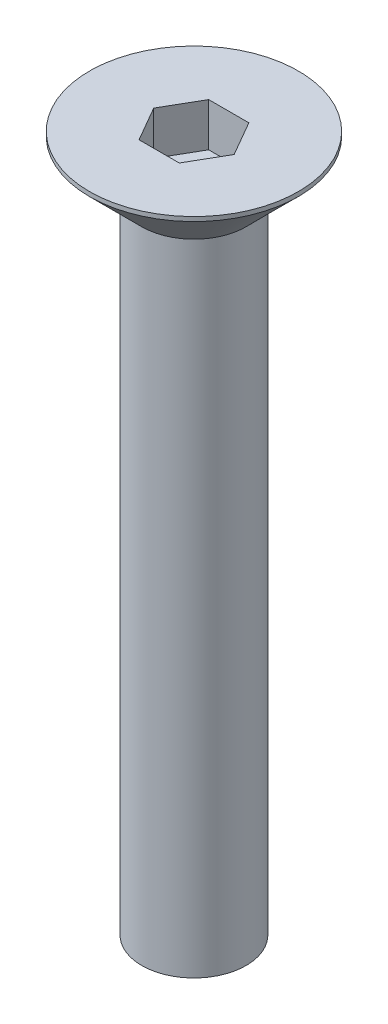
ISO-10303-21;
HEADER;
FILE_DESCRIPTION(('STEP AP214'),'2;1');
FILE_NAME('part.step','',(''),(''),'','','');
FILE_SCHEMA(('AUTOMOTIVE_DESIGN { 1 0 10303 214 1 1 1 1 }'));
ENDSEC;
DATA;
#1=APPLICATION_CONTEXT('core data for automotive mechanical design processes');
#2=APPLICATION_PROTOCOL_DEFINITION('international standard','automotive_design',2000,#1);
#3=PRODUCT_CONTEXT('',#1,'mechanical');
#4=PRODUCT('Part','Part','',(#3));
#5=PRODUCT_RELATED_PRODUCT_CATEGORY('part','',(#4));
#6=PRODUCT_DEFINITION_FORMATION('','',#4);
#7=PRODUCT_DEFINITION_CONTEXT('part definition',#1,'design');
#8=PRODUCT_DEFINITION('design','',#6,#7);
#9=PRODUCT_DEFINITION_SHAPE('','',#8);
#10=(LENGTH_UNIT() NAMED_UNIT(*) SI_UNIT(.MILLI.,.METRE.));
#11=(NAMED_UNIT(*) PLANE_ANGLE_UNIT() SI_UNIT($,.RADIAN.));
#12=(NAMED_UNIT(*) SI_UNIT($,.STERADIAN.) SOLID_ANGLE_UNIT());
#13=UNCERTAINTY_MEASURE_WITH_UNIT(LENGTH_MEASURE(1.E-05),#10,'distance_accuracy_value','');
#14=(GEOMETRIC_REPRESENTATION_CONTEXT(3) GLOBAL_UNCERTAINTY_ASSIGNED_CONTEXT((#13)) GLOBAL_UNIT_ASSIGNED_CONTEXT((#10,
#11,#12)) REPRESENTATION_CONTEXT('',''));
#15=CARTESIAN_POINT('',(0.,0.,0.));
#16=DIRECTION('',(0.,0.,1.));
#17=DIRECTION('',(1.,0.,0.));
#18=AXIS2_PLACEMENT_3D('',#15,#16,#17);
#19=CARTESIAN_POINT('',(0.,-80.,0.));
#20=DIRECTION('',(0.,1.,0.));
#21=DIRECTION('',(0.,0.,1.));
#22=AXIS2_PLACEMENT_3D('',#19,#20,#21);
#23=PLANE('',#22);
#24=CARTESIAN_POINT('',(0.,-80.,0.));
#25=DIRECTION('',(0.,1.,0.));
#26=DIRECTION('',(0.,0.,1.));
#27=AXIS2_PLACEMENT_3D('',#24,#25,#26);
#28=CIRCLE('',#27,6.00000000000002);
#29=CARTESIAN_POINT('',(0.,-80.,6.00000000000002));
#30=VERTEX_POINT('',#29);
#31=EDGE_CURVE('E11',#30,#30,#28,.T.);
#32=ORIENTED_EDGE('',*,*,#31,.F.);
#33=EDGE_LOOP('',(#32));
#34=FACE_BOUND('',#33,.T.);
#35=ADVANCED_FACE('F36',(#34),#23,.F.);
#36=CARTESIAN_POINT('',(0.,61.6916426261037,0.));
#37=DIRECTION('',(0.,1.,0.));
#38=DIRECTION('',(0.,0.,1.));
#39=AXIS2_PLACEMENT_3D('',#36,#37,#38);
#40=CYLINDRICAL_SURFACE('',#39,6.00000000000001);
#41=CARTESIAN_POINT('',(0.,-6.50000000000001,0.));
#42=DIRECTION('',(0.,1.,0.));
#43=DIRECTION('',(0.,0.,1.));
#44=AXIS2_PLACEMENT_3D('',#41,#42,#43);
#45=CIRCLE('',#44,6.00000000000001);
#46=CARTESIAN_POINT('',(0.,-6.50000000000001,6.00000000000001));
#47=VERTEX_POINT('',#46);
#48=EDGE_CURVE('E43',#47,#47,#45,.T.);
#49=ORIENTED_EDGE('',*,*,#48,.F.);
#50=EDGE_LOOP('',(#49));
#51=FACE_BOUND('',#50,.T.);
#52=ORIENTED_EDGE('',*,*,#31,.T.);
#53=EDGE_LOOP('',(#52));
#54=FACE_BOUND('',#53,.T.);
#55=ADVANCED_FACE('F152',(#51,#54),#40,.T.);
#56=CARTESIAN_POINT('',(0.,-6.50000000000001,0.));
#57=DIRECTION('',(0.,1.,0.));
#58=DIRECTION('',(0.,0.,1.));
#59=AXIS2_PLACEMENT_3D('',#56,#57,#58);
#60=CONICAL_SURFACE('',#59,6.00000000000001,0.785398163397447);
#61=CARTESIAN_POINT('',(0.,-0.5,0.));
#62=DIRECTION('',(0.,1.,0.));
#63=DIRECTION('',(0.,0.,1.));
#64=AXIS2_PLACEMENT_3D('',#61,#62,#63);
#65=CIRCLE('',#64,12.);
#66=CARTESIAN_POINT('',(0.,-0.5,12.));
#67=VERTEX_POINT('',#66);
#68=EDGE_CURVE('E145',#67,#67,#65,.T.);
#69=ORIENTED_EDGE('',*,*,#68,.F.);
#70=EDGE_LOOP('',(#69));
#71=FACE_BOUND('',#70,.T.);
#72=ORIENTED_EDGE('',*,*,#48,.T.);
#73=EDGE_LOOP('',(#72));
#74=FACE_BOUND('',#73,.T.);
#75=ADVANCED_FACE('F150',(#71,#74),#60,.T.);
#76=CARTESIAN_POINT('',(0.,61.6916426261037,0.));
#77=DIRECTION('',(0.,1.,0.));
#78=DIRECTION('',(0.,0.,1.));
#79=AXIS2_PLACEMENT_3D('',#76,#77,#78);
#80=CYLINDRICAL_SURFACE('',#79,12.);
#81=CARTESIAN_POINT('',(0.,0.,0.));
#82=DIRECTION('',(0.,1.,0.));
#83=DIRECTION('',(0.,0.,1.));
#84=AXIS2_PLACEMENT_3D('',#81,#82,#83);
#85=CIRCLE('',#84,12.);
#86=CARTESIAN_POINT('',(0.,0.,12.));
#87=VERTEX_POINT('',#86);
#88=EDGE_CURVE('E137',#87,#87,#85,.T.);
#89=ORIENTED_EDGE('',*,*,#88,.F.);
#90=EDGE_LOOP('',(#89));
#91=FACE_BOUND('',#90,.T.);
#92=ORIENTED_EDGE('',*,*,#68,.T.);
#93=EDGE_LOOP('',(#92));
#94=FACE_BOUND('',#93,.T.);
#95=ADVANCED_FACE('F170',(#91,#94),#80,.T.);
#96=CARTESIAN_POINT('',(12.,0.,0.));
#97=DIRECTION('',(0.,-1.,0.));
#98=DIRECTION('',(0.,0.,-1.));
#99=AXIS2_PLACEMENT_3D('',#96,#97,#98);
#100=PLANE('',#99);
#101=DIRECTION('',(-1.,0.,0.));
#102=VECTOR('',#101,1.);
#103=CARTESIAN_POINT('',(2.3094010767585,0.,-4.));
#104=LINE('',#103,#102);
#105=CARTESIAN_POINT('',(2.3094010767585,0.,-4.));
#106=VERTEX_POINT('',#105);
#107=CARTESIAN_POINT('',(-2.3094010767585,0.,-4.));
#108=VERTEX_POINT('',#107);
#109=EDGE_CURVE('E124',#106,#108,#104,.T.);
#110=ORIENTED_EDGE('',*,*,#109,.F.);
#111=DIRECTION('',(-0.5,0.,-0.866025403784439));
#112=VECTOR('',#111,1.);
#113=CARTESIAN_POINT('',(4.61880215351701,0.,0.));
#114=LINE('',#113,#112);
#115=CARTESIAN_POINT('',(4.61880215351701,0.,0.));
#116=VERTEX_POINT('',#115);
#117=EDGE_CURVE('E50',#116,#106,#114,.T.);
#118=ORIENTED_EDGE('',*,*,#117,.F.);
#119=DIRECTION('',(0.5,0.,-0.866025403784439));
#120=VECTOR('',#119,1.);
#121=CARTESIAN_POINT('',(2.3094010767585,0.,4.));
#122=LINE('',#121,#120);
#123=CARTESIAN_POINT('',(2.3094010767585,0.,4.));
#124=VERTEX_POINT('',#123);
#125=EDGE_CURVE('E133',#124,#116,#122,.T.);
#126=ORIENTED_EDGE('',*,*,#125,.F.);
#127=DIRECTION('',(1.,0.,0.));
#128=VECTOR('',#127,1.);
#129=CARTESIAN_POINT('',(-2.3094010767585,0.,4.));
#130=LINE('',#129,#128);
#131=CARTESIAN_POINT('',(-2.3094010767585,0.,4.));
#132=VERTEX_POINT('',#131);
#133=EDGE_CURVE('E131',#132,#124,#130,.T.);
#134=ORIENTED_EDGE('',*,*,#133,.F.);
#135=DIRECTION('',(0.5,0.,0.866025403784438));
#136=VECTOR('',#135,1.);
#137=CARTESIAN_POINT('',(-4.61880215351701,0.,0.));
#138=LINE('',#137,#136);
#139=CARTESIAN_POINT('',(-4.61880215351701,0.,0.));
#140=VERTEX_POINT('',#139);
#141=EDGE_CURVE('E98',#140,#132,#138,.T.);
#142=ORIENTED_EDGE('',*,*,#141,.F.);
#143=DIRECTION('',(-0.5,0.,0.866025403784439));
#144=VECTOR('',#143,1.);
#145=CARTESIAN_POINT('',(-2.3094010767585,0.,-4.));
#146=LINE('',#145,#144);
#147=EDGE_CURVE('E127',#108,#140,#146,.T.);
#148=ORIENTED_EDGE('',*,*,#147,.F.);
#149=EDGE_LOOP('',(#110,#118,#126,#134,#142,#148));
#150=FACE_BOUND('',#149,.T.);
#151=ORIENTED_EDGE('',*,*,#88,.T.);
#152=EDGE_LOOP('',(#151));
#153=FACE_BOUND('',#152,.T.);
#154=ADVANCED_FACE('F178',(#150,#153),#100,.F.);
#155=CARTESIAN_POINT('',(4.61880215351701,-5.,0.));
#156=DIRECTION('',(0.866025403784439,0.,-0.5));
#157=DIRECTION('',(-0.5,0.,-0.866025403784439));
#158=AXIS2_PLACEMENT_3D('',#155,#156,#157);
#159=PLANE('',#158);
#160=ORIENTED_EDGE('',*,*,#117,.T.);
#161=DIRECTION('',(0.,1.,0.));
#162=VECTOR('',#161,1.);
#163=CARTESIAN_POINT('',(2.3094010767585,-5.,-4.));
#164=LINE('',#163,#162);
#165=CARTESIAN_POINT('',(2.3094010767585,-5.,-4.));
#166=VERTEX_POINT('',#165);
#167=EDGE_CURVE('E80',#166,#106,#164,.T.);
#168=ORIENTED_EDGE('',*,*,#167,.F.);
#169=DIRECTION('',(-0.5,0.,-0.866025403784439));
#170=VECTOR('',#169,1.);
#171=CARTESIAN_POINT('',(4.61880215351701,-5.,0.));
#172=LINE('',#171,#170);
#173=CARTESIAN_POINT('',(4.61880215351701,-5.,0.));
#174=VERTEX_POINT('',#173);
#175=EDGE_CURVE('E135',#174,#166,#172,.T.);
#176=ORIENTED_EDGE('',*,*,#175,.F.);
#177=DIRECTION('',(0.,1.,0.));
#178=VECTOR('',#177,1.);
#179=CARTESIAN_POINT('',(4.61880215351701,-5.,0.));
#180=LINE('',#179,#178);
#181=EDGE_CURVE('E58',#174,#116,#180,.T.);
#182=ORIENTED_EDGE('',*,*,#181,.T.);
#183=EDGE_LOOP('',(#160,#168,#176,#182));
#184=FACE_BOUND('',#183,.T.);
#185=ADVANCED_FACE('F186',(#184),#159,.F.);
#186=CARTESIAN_POINT('',(2.3094010767585,-5.,4.));
#187=DIRECTION('',(0.866025403784439,0.,0.5));
#188=DIRECTION('',(0.5,0.,-0.866025403784439));
#189=AXIS2_PLACEMENT_3D('',#186,#187,#188);
#190=PLANE('',#189);
#191=ORIENTED_EDGE('',*,*,#125,.T.);
#192=ORIENTED_EDGE('',*,*,#181,.F.);
#193=DIRECTION('',(0.5,0.,-0.866025403784439));
#194=VECTOR('',#193,1.);
#195=CARTESIAN_POINT('',(2.3094010767585,-5.,4.));
#196=LINE('',#195,#194);
#197=CARTESIAN_POINT('',(2.3094010767585,-5.,4.));
#198=VERTEX_POINT('',#197);
#199=EDGE_CURVE('E110',#198,#174,#196,.T.);
#200=ORIENTED_EDGE('',*,*,#199,.F.);
#201=DIRECTION('',(0.,1.,0.));
#202=VECTOR('',#201,1.);
#203=CARTESIAN_POINT('',(2.3094010767585,-5.,4.));
#204=LINE('',#203,#202);
#205=EDGE_CURVE('E102',#198,#124,#204,.T.);
#206=ORIENTED_EDGE('',*,*,#205,.T.);
#207=EDGE_LOOP('',(#191,#192,#200,#206));
#208=FACE_BOUND('',#207,.T.);
#209=ADVANCED_FACE('F194',(#208),#190,.F.);
#210=CARTESIAN_POINT('',(-2.3094010767585,-5.,4.));
#211=DIRECTION('',(0.,0.,1.));
#212=DIRECTION('',(1.,0.,0.));
#213=AXIS2_PLACEMENT_3D('',#210,#211,#212);
#214=PLANE('',#213);
#215=ORIENTED_EDGE('',*,*,#133,.T.);
#216=ORIENTED_EDGE('',*,*,#205,.F.);
#217=DIRECTION('',(1.,0.,0.));
#218=VECTOR('',#217,1.);
#219=CARTESIAN_POINT('',(-2.3094010767585,-5.,4.));
#220=LINE('',#219,#218);
#221=CARTESIAN_POINT('',(-2.3094010767585,-5.,4.));
#222=VERTEX_POINT('',#221);
#223=EDGE_CURVE('E106',#222,#198,#220,.T.);
#224=ORIENTED_EDGE('',*,*,#223,.F.);
#225=DIRECTION('',(0.,1.,0.));
#226=VECTOR('',#225,1.);
#227=CARTESIAN_POINT('',(-2.3094010767585,-5.,4.));
#228=LINE('',#227,#226);
#229=EDGE_CURVE('E91',#222,#132,#228,.T.);
#230=ORIENTED_EDGE('',*,*,#229,.T.);
#231=EDGE_LOOP('',(#215,#216,#224,#230));
#232=FACE_BOUND('',#231,.T.);
#233=ADVANCED_FACE('F107',(#232),#214,.F.);
#234=CARTESIAN_POINT('',(-4.61880215351701,-5.,0.));
#235=DIRECTION('',(-0.866025403784438,0.,0.5));
#236=DIRECTION('',(0.5,0.,0.866025403784439));
#237=AXIS2_PLACEMENT_3D('',#234,#235,#236);
#238=PLANE('',#237);
#239=ORIENTED_EDGE('',*,*,#141,.T.);
#240=ORIENTED_EDGE('',*,*,#229,.F.);
#241=DIRECTION('',(0.5,0.,0.866025403784438));
#242=VECTOR('',#241,1.);
#243=CARTESIAN_POINT('',(-4.61880215351701,-5.,0.));
#244=LINE('',#243,#242);
#245=CARTESIAN_POINT('',(-4.61880215351701,-5.,0.));
#246=VERTEX_POINT('',#245);
#247=EDGE_CURVE('E95',#246,#222,#244,.T.);
#248=ORIENTED_EDGE('',*,*,#247,.F.);
#249=DIRECTION('',(0.,1.,0.));
#250=VECTOR('',#249,1.);
#251=CARTESIAN_POINT('',(-4.61880215351701,-5.,0.));
#252=LINE('',#251,#250);
#253=EDGE_CURVE('E103',#246,#140,#252,.T.);
#254=ORIENTED_EDGE('',*,*,#253,.T.);
#255=EDGE_LOOP('',(#239,#240,#248,#254));
#256=FACE_BOUND('',#255,.T.);
#257=ADVANCED_FACE('F93',(#256),#238,.F.);
#258=CARTESIAN_POINT('',(-2.3094010767585,-5.,-4.));
#259=DIRECTION('',(-0.866025403784439,0.,-0.5));
#260=DIRECTION('',(-0.5,0.,0.866025403784439));
#261=AXIS2_PLACEMENT_3D('',#258,#259,#260);
#262=PLANE('',#261);
#263=ORIENTED_EDGE('',*,*,#147,.T.);
#264=ORIENTED_EDGE('',*,*,#253,.F.);
#265=DIRECTION('',(-0.5,0.,0.866025403784439));
#266=VECTOR('',#265,1.);
#267=CARTESIAN_POINT('',(-2.3094010767585,-5.,-4.));
#268=LINE('',#267,#266);
#269=CARTESIAN_POINT('',(-2.3094010767585,-5.,-4.));
#270=VERTEX_POINT('',#269);
#271=EDGE_CURVE('E116',#270,#246,#268,.T.);
#272=ORIENTED_EDGE('',*,*,#271,.F.);
#273=DIRECTION('',(0.,1.,0.));
#274=VECTOR('',#273,1.);
#275=CARTESIAN_POINT('',(-2.3094010767585,-5.,-4.));
#276=LINE('',#275,#274);
#277=EDGE_CURVE('E140',#270,#108,#276,.T.);
#278=ORIENTED_EDGE('',*,*,#277,.T.);
#279=EDGE_LOOP('',(#263,#264,#272,#278));
#280=FACE_BOUND('',#279,.T.);
#281=ADVANCED_FACE('F213',(#280),#262,.F.);
#282=CARTESIAN_POINT('',(2.3094010767585,-5.,-4.));
#283=DIRECTION('',(0.,0.,-1.));
#284=DIRECTION('',(-1.,0.,0.));
#285=AXIS2_PLACEMENT_3D('',#282,#283,#284);
#286=PLANE('',#285);
#287=ORIENTED_EDGE('',*,*,#109,.T.);
#288=ORIENTED_EDGE('',*,*,#277,.F.);
#289=DIRECTION('',(-1.,0.,0.));
#290=VECTOR('',#289,1.);
#291=CARTESIAN_POINT('',(2.3094010767585,-5.,-4.));
#292=LINE('',#291,#290);
#293=EDGE_CURVE('E118',#166,#270,#292,.T.);
#294=ORIENTED_EDGE('',*,*,#293,.F.);
#295=ORIENTED_EDGE('',*,*,#167,.T.);
#296=EDGE_LOOP('',(#287,#288,#294,#295));
#297=FACE_BOUND('',#296,.T.);
#298=ADVANCED_FACE('F220',(#297),#286,.F.);
#299=CARTESIAN_POINT('',(6.92820323027551,-5.,4.));
#300=DIRECTION('',(0.,-1.,0.));
#301=DIRECTION('',(0.,0.,-1.));
#302=AXIS2_PLACEMENT_3D('',#299,#300,#301);
#303=PLANE('',#302);
#304=ORIENTED_EDGE('',*,*,#175,.T.);
#305=ORIENTED_EDGE('',*,*,#293,.T.);
#306=ORIENTED_EDGE('',*,*,#271,.T.);
#307=ORIENTED_EDGE('',*,*,#247,.T.);
#308=ORIENTED_EDGE('',*,*,#223,.T.);
#309=ORIENTED_EDGE('',*,*,#199,.T.);
#310=EDGE_LOOP('',(#304,#305,#306,#307,#308,#309));
#311=FACE_BOUND('',#310,.T.);
#312=ADVANCED_FACE('F113',(#311),#303,.F.);
#313=CLOSED_SHELL('',(#35,#55,#75,#95,#154,#185,#209,#233,#257,#281,#298,#312));
#314=MANIFOLD_SOLID_BREP('B2',#313);
#315=ADVANCED_BREP_SHAPE_REPRESENTATION('',(#18,#314),#14);
#316=SHAPE_DEFINITION_REPRESENTATION(#9,#315);
ENDSEC;
END-ISO-10303-21;
